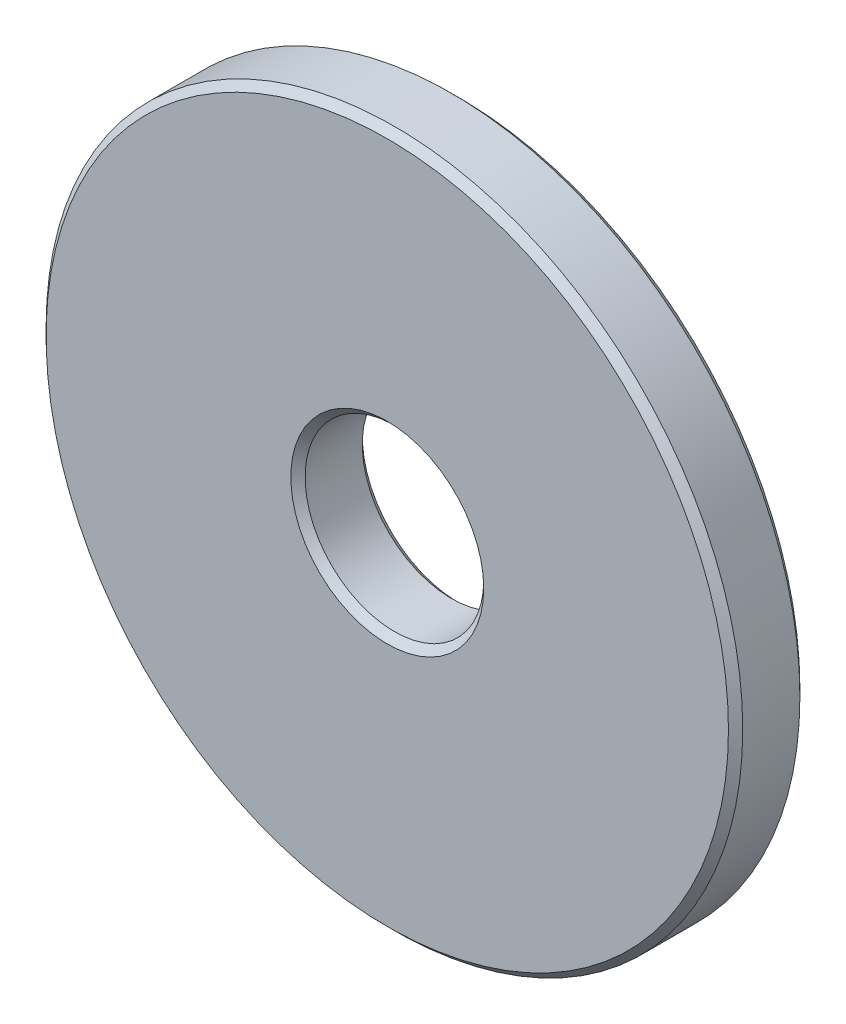
ISO-10303-21;
HEADER;
FILE_DESCRIPTION(('STEP AP214'),'2;1');
FILE_NAME('part.step','',(''),(''),'','','');
FILE_SCHEMA(('AUTOMOTIVE_DESIGN { 1 0 10303 214 1 1 1 1 }'));
ENDSEC;
DATA;
#1=APPLICATION_CONTEXT('core data for automotive mechanical design processes');
#2=APPLICATION_PROTOCOL_DEFINITION('international standard','automotive_design',2000,#1);
#3=PRODUCT_CONTEXT('',#1,'mechanical');
#4=PRODUCT('Part','Part','',(#3));
#5=PRODUCT_RELATED_PRODUCT_CATEGORY('part','',(#4));
#6=PRODUCT_DEFINITION_FORMATION('','',#4);
#7=PRODUCT_DEFINITION_CONTEXT('part definition',#1,'design');
#8=PRODUCT_DEFINITION('design','',#6,#7);
#9=PRODUCT_DEFINITION_SHAPE('','',#8);
#10=(LENGTH_UNIT() NAMED_UNIT(*) SI_UNIT(.MILLI.,.METRE.));
#11=(NAMED_UNIT(*) PLANE_ANGLE_UNIT() SI_UNIT($,.RADIAN.));
#12=(NAMED_UNIT(*) SI_UNIT($,.STERADIAN.) SOLID_ANGLE_UNIT());
#13=UNCERTAINTY_MEASURE_WITH_UNIT(LENGTH_MEASURE(1.E-05),#10,'distance_accuracy_value','');
#14=(GEOMETRIC_REPRESENTATION_CONTEXT(3) GLOBAL_UNCERTAINTY_ASSIGNED_CONTEXT((#13)) GLOBAL_UNIT_ASSIGNED_CONTEXT((#10,
#11,#12)) REPRESENTATION_CONTEXT('',''));
#15=CARTESIAN_POINT('',(0.,0.,0.));
#16=DIRECTION('',(0.,0.,1.));
#17=DIRECTION('',(1.,0.,0.));
#18=AXIS2_PLACEMENT_3D('',#15,#16,#17);
#19=CARTESIAN_POINT('',(0.,0.,2.));
#20=DIRECTION('',(0.,0.,-1.));
#21=DIRECTION('',(-1.,0.,0.));
#22=AXIS2_PLACEMENT_3D('',#19,#20,#21);
#23=CYLINDRICAL_SURFACE('',#22,9.75);
#24=CARTESIAN_POINT('',(0.,0.,0.2));
#25=DIRECTION('',(0.,0.,1.));
#26=DIRECTION('',(1.,0.,0.));
#27=AXIS2_PLACEMENT_3D('',#24,#25,#26);
#28=CIRCLE('',#27,9.75);
#29=CARTESIAN_POINT('',(9.75,0.,0.2));
#30=VERTEX_POINT('',#29);
#31=EDGE_CURVE('E10',#30,#30,#28,.T.);
#32=ORIENTED_EDGE('',*,*,#31,.T.);
#33=EDGE_LOOP('',(#32));
#34=FACE_BOUND('',#33,.T.);
#35=CARTESIAN_POINT('',(0.,0.,1.8));
#36=DIRECTION('',(0.,0.,1.));
#37=DIRECTION('',(1.,0.,0.));
#38=AXIS2_PLACEMENT_3D('',#35,#36,#37);
#39=CIRCLE('',#38,9.75);
#40=CARTESIAN_POINT('',(9.75,0.,1.8));
#41=VERTEX_POINT('',#40);
#42=EDGE_CURVE('E23',#41,#41,#39,.F.);
#43=ORIENTED_EDGE('',*,*,#42,.T.);
#44=EDGE_LOOP('',(#43));
#45=FACE_BOUND('',#44,.T.);
#46=ADVANCED_FACE('F15',(#34,#45),#23,.T.);
#47=CARTESIAN_POINT('',(0.,0.,2.));
#48=DIRECTION('',(0.,0.,-1.));
#49=DIRECTION('',(-1.,0.,0.));
#50=AXIS2_PLACEMENT_3D('',#47,#48,#49);
#51=CYLINDRICAL_SURFACE('',#50,2.5);
#52=CARTESIAN_POINT('',(0.,0.,1.8));
#53=DIRECTION('',(0.,0.,1.));
#54=DIRECTION('',(1.,0.,0.));
#55=AXIS2_PLACEMENT_3D('',#52,#53,#54);
#56=CIRCLE('',#55,2.5);
#57=CARTESIAN_POINT('',(2.5,0.,1.8));
#58=VERTEX_POINT('',#57);
#59=EDGE_CURVE('E53',#58,#58,#56,.T.);
#60=ORIENTED_EDGE('',*,*,#59,.T.);
#61=EDGE_LOOP('',(#60));
#62=FACE_BOUND('',#61,.T.);
#63=CARTESIAN_POINT('',(0.,0.,0.2));
#64=DIRECTION('',(0.,0.,1.));
#65=DIRECTION('',(1.,0.,0.));
#66=AXIS2_PLACEMENT_3D('',#63,#64,#65);
#67=CIRCLE('',#66,2.5);
#68=CARTESIAN_POINT('',(2.5,0.,0.2));
#69=VERTEX_POINT('',#68);
#70=EDGE_CURVE('E56',#69,#69,#67,.F.);
#71=ORIENTED_EDGE('',*,*,#70,.T.);
#72=EDGE_LOOP('',(#71));
#73=FACE_BOUND('',#72,.T.);
#74=ADVANCED_FACE('F61',(#62,#73),#51,.F.);
#75=CARTESIAN_POINT('',(0.,0.,2.));
#76=DIRECTION('',(0.,0.,1.));
#77=DIRECTION('',(1.,0.,0.));
#78=AXIS2_PLACEMENT_3D('',#75,#76,#77);
#79=PLANE('',#78);
#80=CARTESIAN_POINT('',(0.,0.,2.));
#81=DIRECTION('',(0.,0.,1.));
#82=DIRECTION('',(1.,0.,0.));
#83=AXIS2_PLACEMENT_3D('',#80,#81,#82);
#84=CIRCLE('',#83,2.7);
#85=CARTESIAN_POINT('',(2.7,0.,2.));
#86=VERTEX_POINT('',#85);
#87=EDGE_CURVE('E46',#86,#86,#84,.F.);
#88=ORIENTED_EDGE('',*,*,#87,.T.);
#89=EDGE_LOOP('',(#88));
#90=FACE_BOUND('',#89,.T.);
#91=CARTESIAN_POINT('',(0.,0.,2.));
#92=DIRECTION('',(0.,0.,1.));
#93=DIRECTION('',(1.,0.,0.));
#94=AXIS2_PLACEMENT_3D('',#91,#92,#93);
#95=CIRCLE('',#94,9.55);
#96=CARTESIAN_POINT('',(9.55,0.,2.));
#97=VERTEX_POINT('',#96);
#98=EDGE_CURVE('E50',#97,#97,#95,.T.);
#99=ORIENTED_EDGE('',*,*,#98,.T.);
#100=EDGE_LOOP('',(#99));
#101=FACE_BOUND('',#100,.T.);
#102=ADVANCED_FACE('F74',(#90,#101),#79,.T.);
#103=CARTESIAN_POINT('',(0.,0.,0.));
#104=DIRECTION('',(0.,0.,1.));
#105=DIRECTION('',(1.,0.,0.));
#106=AXIS2_PLACEMENT_3D('',#103,#104,#105);
#107=PLANE('',#106);
#108=CARTESIAN_POINT('',(0.,0.,0.));
#109=DIRECTION('',(0.,0.,1.));
#110=DIRECTION('',(1.,0.,0.));
#111=AXIS2_PLACEMENT_3D('',#108,#109,#110);
#112=CIRCLE('',#111,2.7);
#113=CARTESIAN_POINT('',(2.7,0.,0.));
#114=VERTEX_POINT('',#113);
#115=EDGE_CURVE('E32',#114,#114,#112,.T.);
#116=ORIENTED_EDGE('',*,*,#115,.T.);
#117=EDGE_LOOP('',(#116));
#118=FACE_BOUND('',#117,.T.);
#119=CARTESIAN_POINT('',(0.,0.,0.));
#120=DIRECTION('',(0.,0.,1.));
#121=DIRECTION('',(1.,0.,0.));
#122=AXIS2_PLACEMENT_3D('',#119,#120,#121);
#123=CIRCLE('',#122,9.55);
#124=CARTESIAN_POINT('',(9.55,0.,0.));
#125=VERTEX_POINT('',#124);
#126=EDGE_CURVE('E40',#125,#125,#123,.F.);
#127=ORIENTED_EDGE('',*,*,#126,.T.);
#128=EDGE_LOOP('',(#127));
#129=FACE_BOUND('',#128,.T.);
#130=ADVANCED_FACE('F71',(#118,#129),#107,.F.);
#131=CARTESIAN_POINT('',(0.,0.,1.8));
#132=DIRECTION('',(0.,0.,1.));
#133=DIRECTION('',(1.,0.,0.));
#134=AXIS2_PLACEMENT_3D('',#131,#132,#133);
#135=CONICAL_SURFACE('',#134,2.5,0.785398163397448);
#136=ORIENTED_EDGE('',*,*,#87,.F.);
#137=EDGE_LOOP('',(#136));
#138=FACE_BOUND('',#137,.T.);
#139=ORIENTED_EDGE('',*,*,#59,.F.);
#140=EDGE_LOOP('',(#139));
#141=FACE_BOUND('',#140,.T.);
#142=ADVANCED_FACE('F67',(#138,#141),#135,.F.);
#143=CARTESIAN_POINT('',(0.,0.,0.));
#144=DIRECTION('',(0.,0.,-1.));
#145=DIRECTION('',(-1.,0.,0.));
#146=AXIS2_PLACEMENT_3D('',#143,#144,#145);
#147=CONICAL_SURFACE('',#146,2.7,0.785398163397448);
#148=ORIENTED_EDGE('',*,*,#70,.F.);
#149=EDGE_LOOP('',(#148));
#150=FACE_BOUND('',#149,.T.);
#151=ORIENTED_EDGE('',*,*,#115,.F.);
#152=EDGE_LOOP('',(#151));
#153=FACE_BOUND('',#152,.T.);
#154=ADVANCED_FACE('F63',(#150,#153),#147,.F.);
#155=CARTESIAN_POINT('',(0.,0.,0.2));
#156=DIRECTION('',(0.,0.,1.));
#157=DIRECTION('',(1.,0.,0.));
#158=AXIS2_PLACEMENT_3D('',#155,#156,#157);
#159=CONICAL_SURFACE('',#158,9.75,0.785398163397449);
#160=ORIENTED_EDGE('',*,*,#126,.F.);
#161=EDGE_LOOP('',(#160));
#162=FACE_BOUND('',#161,.T.);
#163=ORIENTED_EDGE('',*,*,#31,.F.);
#164=EDGE_LOOP('',(#163));
#165=FACE_BOUND('',#164,.T.);
#166=ADVANCED_FACE('F66',(#162,#165),#159,.T.);
#167=CARTESIAN_POINT('',(0.,0.,2.));
#168=DIRECTION('',(0.,0.,-1.));
#169=DIRECTION('',(-1.,0.,0.));
#170=AXIS2_PLACEMENT_3D('',#167,#168,#169);
#171=CONICAL_SURFACE('',#170,9.55,0.785398163397449);
#172=ORIENTED_EDGE('',*,*,#42,.F.);
#173=EDGE_LOOP('',(#172));
#174=FACE_BOUND('',#173,.T.);
#175=ORIENTED_EDGE('',*,*,#98,.F.);
#176=EDGE_LOOP('',(#175));
#177=FACE_BOUND('',#176,.T.);
#178=ADVANCED_FACE('F17',(#174,#177),#171,.T.);
#179=CLOSED_SHELL('',(#46,#74,#102,#130,#142,#154,#166,#178));
#180=MANIFOLD_SOLID_BREP('B1',#179);
#181=ADVANCED_BREP_SHAPE_REPRESENTATION('',(#18,#180),#14);
#182=SHAPE_DEFINITION_REPRESENTATION(#9,#181);
ENDSEC;
END-ISO-10303-21;
